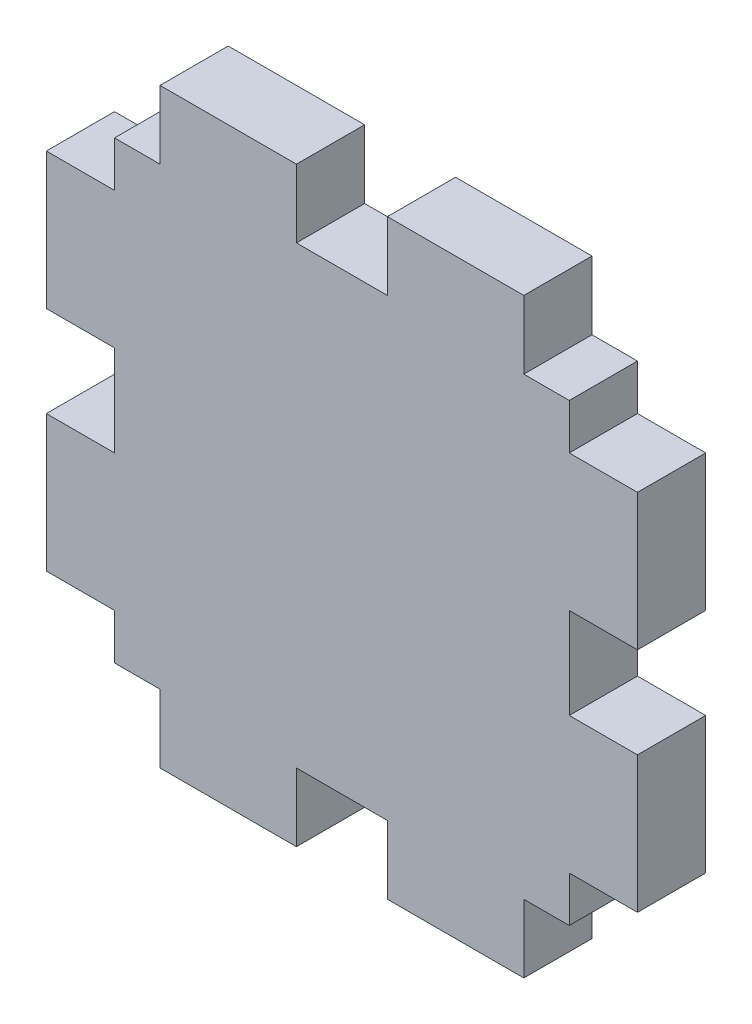
ISO-10303-21;
HEADER;
FILE_DESCRIPTION(('STEP AP214'),'2;1');
FILE_NAME('part.step','',(''),(''),'','','');
FILE_SCHEMA(('AUTOMOTIVE_DESIGN { 1 0 10303 214 1 1 1 1 }'));
ENDSEC;
DATA;
#1=APPLICATION_CONTEXT('core data for automotive mechanical design processes');
#2=APPLICATION_PROTOCOL_DEFINITION('international standard','automotive_design',2000,#1);
#3=PRODUCT_CONTEXT('',#1,'mechanical');
#4=PRODUCT('Part','Part','',(#3));
#5=PRODUCT_RELATED_PRODUCT_CATEGORY('part','',(#4));
#6=PRODUCT_DEFINITION_FORMATION('','',#4);
#7=PRODUCT_DEFINITION_CONTEXT('part definition',#1,'design');
#8=PRODUCT_DEFINITION('design','',#6,#7);
#9=PRODUCT_DEFINITION_SHAPE('','',#8);
#10=(LENGTH_UNIT() NAMED_UNIT(*) SI_UNIT(.MILLI.,.METRE.));
#11=(NAMED_UNIT(*) PLANE_ANGLE_UNIT() SI_UNIT($,.RADIAN.));
#12=(NAMED_UNIT(*) SI_UNIT($,.STERADIAN.) SOLID_ANGLE_UNIT());
#13=UNCERTAINTY_MEASURE_WITH_UNIT(LENGTH_MEASURE(1.E-05),#10,'distance_accuracy_value','');
#14=(GEOMETRIC_REPRESENTATION_CONTEXT(3) GLOBAL_UNCERTAINTY_ASSIGNED_CONTEXT((#13)) GLOBAL_UNIT_ASSIGNED_CONTEXT((#10,
#11,#12)) REPRESENTATION_CONTEXT('',''));
#15=CARTESIAN_POINT('',(0.,0.,0.));
#16=DIRECTION('',(0.,0.,1.));
#17=DIRECTION('',(1.,0.,0.));
#18=AXIS2_PLACEMENT_3D('',#15,#16,#17);
#19=CARTESIAN_POINT('',(8.,-10.,3.));
#20=DIRECTION('',(0.,1.,0.));
#21=DIRECTION('',(0.,0.,1.));
#22=AXIS2_PLACEMENT_3D('',#19,#20,#21);
#23=PLANE('',#22);
#24=DIRECTION('',(1.,0.,0.));
#25=VECTOR('',#24,1.);
#26=CARTESIAN_POINT('',(8.,-10.,0.));
#27=LINE('',#26,#25);
#28=CARTESIAN_POINT('',(8.,-10.,0.));
#29=VERTEX_POINT('',#28);
#30=CARTESIAN_POINT('',(10.,-10.,0.));
#31=VERTEX_POINT('',#30);
#32=EDGE_CURVE('E308',#29,#31,#27,.T.);
#33=ORIENTED_EDGE('',*,*,#32,.T.);
#34=DIRECTION('',(0.,0.,-1.));
#35=VECTOR('',#34,1.);
#36=CARTESIAN_POINT('',(10.,-10.,3.));
#37=LINE('',#36,#35);
#38=CARTESIAN_POINT('',(10.,-10.,3.));
#39=VERTEX_POINT('',#38);
#40=EDGE_CURVE('E11',#39,#31,#37,.T.);
#41=ORIENTED_EDGE('',*,*,#40,.F.);
#42=DIRECTION('',(1.,0.,0.));
#43=VECTOR('',#42,1.);
#44=CARTESIAN_POINT('',(8.,-10.,3.));
#45=LINE('',#44,#43);
#46=CARTESIAN_POINT('',(8.,-10.,3.));
#47=VERTEX_POINT('',#46);
#48=EDGE_CURVE('E414',#47,#39,#45,.T.);
#49=ORIENTED_EDGE('',*,*,#48,.F.);
#50=DIRECTION('',(0.,0.,-1.));
#51=VECTOR('',#50,1.);
#52=CARTESIAN_POINT('',(8.,-10.,3.));
#53=LINE('',#52,#51);
#54=EDGE_CURVE('E304',#47,#29,#53,.T.);
#55=ORIENTED_EDGE('',*,*,#54,.T.);
#56=EDGE_LOOP('',(#33,#41,#49,#55));
#57=FACE_BOUND('',#56,.T.);
#58=ADVANCED_FACE('F39',(#57),#23,.F.);
#59=CARTESIAN_POINT('',(10.,-8.,3.));
#60=DIRECTION('',(-1.,0.,0.));
#61=DIRECTION('',(0.,0.,1.));
#62=AXIS2_PLACEMENT_3D('',#59,#60,#61);
#63=PLANE('',#62);
#64=DIRECTION('',(0.,1.,0.));
#65=VECTOR('',#64,1.);
#66=CARTESIAN_POINT('',(10.,-8.,0.));
#67=LINE('',#66,#65);
#68=CARTESIAN_POINT('',(10.,-8.,0.));
#69=VERTEX_POINT('',#68);
#70=EDGE_CURVE('E312',#31,#69,#67,.T.);
#71=ORIENTED_EDGE('',*,*,#70,.T.);
#72=DIRECTION('',(0.,0.,-1.));
#73=VECTOR('',#72,1.);
#74=CARTESIAN_POINT('',(10.,-8.,3.));
#75=LINE('',#74,#73);
#76=CARTESIAN_POINT('',(10.,-8.,3.));
#77=VERTEX_POINT('',#76);
#78=EDGE_CURVE('E48',#77,#69,#75,.T.);
#79=ORIENTED_EDGE('',*,*,#78,.F.);
#80=DIRECTION('',(0.,1.,0.));
#81=VECTOR('',#80,1.);
#82=CARTESIAN_POINT('',(10.,-8.,3.));
#83=LINE('',#82,#81);
#84=EDGE_CURVE('E183',#39,#77,#83,.T.);
#85=ORIENTED_EDGE('',*,*,#84,.F.);
#86=ORIENTED_EDGE('',*,*,#40,.T.);
#87=EDGE_LOOP('',(#71,#79,#85,#86));
#88=FACE_BOUND('',#87,.T.);
#89=ADVANCED_FACE('F676',(#88),#63,.F.);
#90=CARTESIAN_POINT('',(10.,-8.,3.));
#91=DIRECTION('',(0.,1.,0.));
#92=DIRECTION('',(0.,0.,1.));
#93=AXIS2_PLACEMENT_3D('',#90,#91,#92);
#94=PLANE('',#93);
#95=DIRECTION('',(1.,0.,0.));
#96=VECTOR('',#95,1.);
#97=CARTESIAN_POINT('',(10.,-8.,0.));
#98=LINE('',#97,#96);
#99=CARTESIAN_POINT('',(13.,-8.,0.));
#100=VERTEX_POINT('',#99);
#101=EDGE_CURVE('E315',#69,#100,#98,.T.);
#102=ORIENTED_EDGE('',*,*,#101,.T.);
#103=DIRECTION('',(0.,0.,-1.));
#104=VECTOR('',#103,1.);
#105=CARTESIAN_POINT('',(13.,-8.,3.));
#106=LINE('',#105,#104);
#107=CARTESIAN_POINT('',(13.,-8.,3.));
#108=VERTEX_POINT('',#107);
#109=EDGE_CURVE('E537',#108,#100,#106,.T.);
#110=ORIENTED_EDGE('',*,*,#109,.F.);
#111=DIRECTION('',(1.,0.,0.));
#112=VECTOR('',#111,1.);
#113=CARTESIAN_POINT('',(10.,-8.,3.));
#114=LINE('',#113,#112);
#115=EDGE_CURVE('E547',#77,#108,#114,.T.);
#116=ORIENTED_EDGE('',*,*,#115,.F.);
#117=ORIENTED_EDGE('',*,*,#78,.T.);
#118=EDGE_LOOP('',(#102,#110,#116,#117));
#119=FACE_BOUND('',#118,.T.);
#120=ADVANCED_FACE('F545',(#119),#94,.F.);
#121=CARTESIAN_POINT('',(13.,-8.,3.));
#122=DIRECTION('',(-1.,0.,0.));
#123=DIRECTION('',(0.,-1.,0.));
#124=AXIS2_PLACEMENT_3D('',#121,#122,#123);
#125=PLANE('',#124);
#126=DIRECTION('',(0.,1.,0.));
#127=VECTOR('',#126,1.);
#128=CARTESIAN_POINT('',(13.,-8.,0.));
#129=LINE('',#128,#127);
#130=CARTESIAN_POINT('',(13.,-2.,0.));
#131=VERTEX_POINT('',#130);
#132=EDGE_CURVE('E318',#100,#131,#129,.T.);
#133=ORIENTED_EDGE('',*,*,#132,.T.);
#134=DIRECTION('',(0.,0.,-1.));
#135=VECTOR('',#134,1.);
#136=CARTESIAN_POINT('',(13.,-2.,3.));
#137=LINE('',#136,#135);
#138=CARTESIAN_POINT('',(13.,-2.,3.));
#139=VERTEX_POINT('',#138);
#140=EDGE_CURVE('E533',#139,#131,#137,.T.);
#141=ORIENTED_EDGE('',*,*,#140,.F.);
#142=DIRECTION('',(0.,1.,0.));
#143=VECTOR('',#142,1.);
#144=CARTESIAN_POINT('',(13.,-8.,3.));
#145=LINE('',#144,#143);
#146=EDGE_CURVE('E566',#108,#139,#145,.T.);
#147=ORIENTED_EDGE('',*,*,#146,.F.);
#148=ORIENTED_EDGE('',*,*,#109,.T.);
#149=EDGE_LOOP('',(#133,#141,#147,#148));
#150=FACE_BOUND('',#149,.T.);
#151=ADVANCED_FACE('F556',(#150),#125,.F.);
#152=CARTESIAN_POINT('',(10.,-2.,3.));
#153=DIRECTION('',(0.,-1.,0.));
#154=DIRECTION('',(0.,0.,-1.));
#155=AXIS2_PLACEMENT_3D('',#152,#153,#154);
#156=PLANE('',#155);
#157=DIRECTION('',(-1.,0.,0.));
#158=VECTOR('',#157,1.);
#159=CARTESIAN_POINT('',(10.,-2.,0.));
#160=LINE('',#159,#158);
#161=CARTESIAN_POINT('',(10.,-2.,0.));
#162=VERTEX_POINT('',#161);
#163=EDGE_CURVE('E321',#131,#162,#160,.T.);
#164=ORIENTED_EDGE('',*,*,#163,.T.);
#165=DIRECTION('',(0.,0.,-1.));
#166=VECTOR('',#165,1.);
#167=CARTESIAN_POINT('',(10.,-2.,3.));
#168=LINE('',#167,#166);
#169=CARTESIAN_POINT('',(10.,-2.,3.));
#170=VERTEX_POINT('',#169);
#171=EDGE_CURVE('E529',#170,#162,#168,.T.);
#172=ORIENTED_EDGE('',*,*,#171,.F.);
#173=DIRECTION('',(-1.,0.,0.));
#174=VECTOR('',#173,1.);
#175=CARTESIAN_POINT('',(10.,-2.,3.));
#176=LINE('',#175,#174);
#177=EDGE_CURVE('E562',#139,#170,#176,.T.);
#178=ORIENTED_EDGE('',*,*,#177,.F.);
#179=ORIENTED_EDGE('',*,*,#140,.T.);
#180=EDGE_LOOP('',(#164,#172,#178,#179));
#181=FACE_BOUND('',#180,.T.);
#182=ADVANCED_FACE('F560',(#181),#156,.F.);
#183=CARTESIAN_POINT('',(10.,2.,3.));
#184=DIRECTION('',(-1.,0.,0.));
#185=DIRECTION('',(0.,0.,1.));
#186=AXIS2_PLACEMENT_3D('',#183,#184,#185);
#187=PLANE('',#186);
#188=DIRECTION('',(0.,1.,0.));
#189=VECTOR('',#188,1.);
#190=CARTESIAN_POINT('',(10.,2.,0.));
#191=LINE('',#190,#189);
#192=CARTESIAN_POINT('',(10.,2.,0.));
#193=VERTEX_POINT('',#192);
#194=EDGE_CURVE('E324',#162,#193,#191,.T.);
#195=ORIENTED_EDGE('',*,*,#194,.T.);
#196=DIRECTION('',(0.,0.,-1.));
#197=VECTOR('',#196,1.);
#198=CARTESIAN_POINT('',(10.,2.,3.));
#199=LINE('',#198,#197);
#200=CARTESIAN_POINT('',(10.,2.,3.));
#201=VERTEX_POINT('',#200);
#202=EDGE_CURVE('E525',#201,#193,#199,.T.);
#203=ORIENTED_EDGE('',*,*,#202,.F.);
#204=DIRECTION('',(0.,1.,0.));
#205=VECTOR('',#204,1.);
#206=CARTESIAN_POINT('',(10.,2.,3.));
#207=LINE('',#206,#205);
#208=EDGE_CURVE('E565',#170,#201,#207,.T.);
#209=ORIENTED_EDGE('',*,*,#208,.F.);
#210=ORIENTED_EDGE('',*,*,#171,.T.);
#211=EDGE_LOOP('',(#195,#203,#209,#210));
#212=FACE_BOUND('',#211,.T.);
#213=ADVANCED_FACE('F689',(#212),#187,.F.);
#214=CARTESIAN_POINT('',(10.,2.,3.));
#215=DIRECTION('',(0.,1.,0.));
#216=DIRECTION('',(0.,0.,1.));
#217=AXIS2_PLACEMENT_3D('',#214,#215,#216);
#218=PLANE('',#217);
#219=DIRECTION('',(1.,0.,0.));
#220=VECTOR('',#219,1.);
#221=CARTESIAN_POINT('',(10.,2.,0.));
#222=LINE('',#221,#220);
#223=CARTESIAN_POINT('',(13.,2.,0.));
#224=VERTEX_POINT('',#223);
#225=EDGE_CURVE('E327',#193,#224,#222,.T.);
#226=ORIENTED_EDGE('',*,*,#225,.T.);
#227=DIRECTION('',(0.,0.,-1.));
#228=VECTOR('',#227,1.);
#229=CARTESIAN_POINT('',(13.,2.,3.));
#230=LINE('',#229,#228);
#231=CARTESIAN_POINT('',(13.,2.,3.));
#232=VERTEX_POINT('',#231);
#233=EDGE_CURVE('E521',#232,#224,#230,.T.);
#234=ORIENTED_EDGE('',*,*,#233,.F.);
#235=DIRECTION('',(1.,0.,0.));
#236=VECTOR('',#235,1.);
#237=CARTESIAN_POINT('',(10.,2.,3.));
#238=LINE('',#237,#236);
#239=EDGE_CURVE('E570',#201,#232,#238,.T.);
#240=ORIENTED_EDGE('',*,*,#239,.F.);
#241=ORIENTED_EDGE('',*,*,#202,.T.);
#242=EDGE_LOOP('',(#226,#234,#240,#241));
#243=FACE_BOUND('',#242,.T.);
#244=ADVANCED_FACE('F692',(#243),#218,.F.);
#245=CARTESIAN_POINT('',(13.,8.,3.));
#246=DIRECTION('',(-1.,0.,0.));
#247=DIRECTION('',(0.,-1.,0.));
#248=AXIS2_PLACEMENT_3D('',#245,#246,#247);
#249=PLANE('',#248);
#250=DIRECTION('',(0.,1.,0.));
#251=VECTOR('',#250,1.);
#252=CARTESIAN_POINT('',(13.,8.,0.));
#253=LINE('',#252,#251);
#254=CARTESIAN_POINT('',(13.,8.,0.));
#255=VERTEX_POINT('',#254);
#256=EDGE_CURVE('E330',#224,#255,#253,.T.);
#257=ORIENTED_EDGE('',*,*,#256,.T.);
#258=DIRECTION('',(0.,0.,-1.));
#259=VECTOR('',#258,1.);
#260=CARTESIAN_POINT('',(13.,8.,3.));
#261=LINE('',#260,#259);
#262=CARTESIAN_POINT('',(13.,8.,3.));
#263=VERTEX_POINT('',#262);
#264=EDGE_CURVE('E517',#263,#255,#261,.T.);
#265=ORIENTED_EDGE('',*,*,#264,.F.);
#266=DIRECTION('',(0.,1.,0.));
#267=VECTOR('',#266,1.);
#268=CARTESIAN_POINT('',(13.,8.,3.));
#269=LINE('',#268,#267);
#270=EDGE_CURVE('E577',#232,#263,#269,.T.);
#271=ORIENTED_EDGE('',*,*,#270,.F.);
#272=ORIENTED_EDGE('',*,*,#233,.T.);
#273=EDGE_LOOP('',(#257,#265,#271,#272));
#274=FACE_BOUND('',#273,.T.);
#275=ADVANCED_FACE('F696',(#274),#249,.F.);
#276=CARTESIAN_POINT('',(10.,8.,3.));
#277=DIRECTION('',(0.,-1.,0.));
#278=DIRECTION('',(0.,0.,-1.));
#279=AXIS2_PLACEMENT_3D('',#276,#277,#278);
#280=PLANE('',#279);
#281=DIRECTION('',(-1.,0.,0.));
#282=VECTOR('',#281,1.);
#283=CARTESIAN_POINT('',(10.,8.,0.));
#284=LINE('',#283,#282);
#285=CARTESIAN_POINT('',(10.,8.,0.));
#286=VERTEX_POINT('',#285);
#287=EDGE_CURVE('E333',#255,#286,#284,.T.);
#288=ORIENTED_EDGE('',*,*,#287,.T.);
#289=DIRECTION('',(0.,0.,-1.));
#290=VECTOR('',#289,1.);
#291=CARTESIAN_POINT('',(10.,8.,3.));
#292=LINE('',#291,#290);
#293=CARTESIAN_POINT('',(10.,8.,3.));
#294=VERTEX_POINT('',#293);
#295=EDGE_CURVE('E513',#294,#286,#292,.T.);
#296=ORIENTED_EDGE('',*,*,#295,.F.);
#297=DIRECTION('',(-1.,0.,0.));
#298=VECTOR('',#297,1.);
#299=CARTESIAN_POINT('',(10.,8.,3.));
#300=LINE('',#299,#298);
#301=EDGE_CURVE('E580',#263,#294,#300,.T.);
#302=ORIENTED_EDGE('',*,*,#301,.F.);
#303=ORIENTED_EDGE('',*,*,#264,.T.);
#304=EDGE_LOOP('',(#288,#296,#302,#303));
#305=FACE_BOUND('',#304,.T.);
#306=ADVANCED_FACE('F700',(#305),#280,.F.);
#307=CARTESIAN_POINT('',(10.,10.,3.));
#308=DIRECTION('',(-1.,0.,0.));
#309=DIRECTION('',(0.,0.,1.));
#310=AXIS2_PLACEMENT_3D('',#307,#308,#309);
#311=PLANE('',#310);
#312=DIRECTION('',(0.,1.,0.));
#313=VECTOR('',#312,1.);
#314=CARTESIAN_POINT('',(10.,10.,0.));
#315=LINE('',#314,#313);
#316=CARTESIAN_POINT('',(10.,10.,0.));
#317=VERTEX_POINT('',#316);
#318=EDGE_CURVE('E336',#286,#317,#315,.T.);
#319=ORIENTED_EDGE('',*,*,#318,.T.);
#320=DIRECTION('',(0.,0.,-1.));
#321=VECTOR('',#320,1.);
#322=CARTESIAN_POINT('',(10.,10.,3.));
#323=LINE('',#322,#321);
#324=CARTESIAN_POINT('',(10.,10.,3.));
#325=VERTEX_POINT('',#324);
#326=EDGE_CURVE('E509',#325,#317,#323,.T.);
#327=ORIENTED_EDGE('',*,*,#326,.F.);
#328=DIRECTION('',(0.,1.,0.));
#329=VECTOR('',#328,1.);
#330=CARTESIAN_POINT('',(10.,10.,3.));
#331=LINE('',#330,#329);
#332=EDGE_CURVE('E583',#294,#325,#331,.T.);
#333=ORIENTED_EDGE('',*,*,#332,.F.);
#334=ORIENTED_EDGE('',*,*,#295,.T.);
#335=EDGE_LOOP('',(#319,#327,#333,#334));
#336=FACE_BOUND('',#335,.T.);
#337=ADVANCED_FACE('F704',(#336),#311,.F.);
#338=CARTESIAN_POINT('',(8.,10.,3.));
#339=DIRECTION('',(0.,-1.,0.));
#340=DIRECTION('',(0.,0.,-1.));
#341=AXIS2_PLACEMENT_3D('',#338,#339,#340);
#342=PLANE('',#341);
#343=DIRECTION('',(-1.,0.,0.));
#344=VECTOR('',#343,1.);
#345=CARTESIAN_POINT('',(8.,10.,0.));
#346=LINE('',#345,#344);
#347=CARTESIAN_POINT('',(8.,10.,0.));
#348=VERTEX_POINT('',#347);
#349=EDGE_CURVE('E339',#317,#348,#346,.T.);
#350=ORIENTED_EDGE('',*,*,#349,.T.);
#351=DIRECTION('',(0.,0.,-1.));
#352=VECTOR('',#351,1.);
#353=CARTESIAN_POINT('',(8.,10.,3.));
#354=LINE('',#353,#352);
#355=CARTESIAN_POINT('',(8.,10.,3.));
#356=VERTEX_POINT('',#355);
#357=EDGE_CURVE('E505',#356,#348,#354,.T.);
#358=ORIENTED_EDGE('',*,*,#357,.F.);
#359=DIRECTION('',(-1.,0.,0.));
#360=VECTOR('',#359,1.);
#361=CARTESIAN_POINT('',(8.,10.,3.));
#362=LINE('',#361,#360);
#363=EDGE_CURVE('E586',#325,#356,#362,.T.);
#364=ORIENTED_EDGE('',*,*,#363,.F.);
#365=ORIENTED_EDGE('',*,*,#326,.T.);
#366=EDGE_LOOP('',(#350,#358,#364,#365));
#367=FACE_BOUND('',#366,.T.);
#368=ADVANCED_FACE('F708',(#367),#342,.F.);
#369=CARTESIAN_POINT('',(8.,10.,3.));
#370=DIRECTION('',(-1.,0.,0.));
#371=DIRECTION('',(0.,0.,1.));
#372=AXIS2_PLACEMENT_3D('',#369,#370,#371);
#373=PLANE('',#372);
#374=DIRECTION('',(0.,1.,0.));
#375=VECTOR('',#374,1.);
#376=CARTESIAN_POINT('',(8.,10.,0.));
#377=LINE('',#376,#375);
#378=CARTESIAN_POINT('',(8.,13.,0.));
#379=VERTEX_POINT('',#378);
#380=EDGE_CURVE('E342',#348,#379,#377,.T.);
#381=ORIENTED_EDGE('',*,*,#380,.T.);
#382=DIRECTION('',(0.,0.,-1.));
#383=VECTOR('',#382,1.);
#384=CARTESIAN_POINT('',(8.,13.,3.));
#385=LINE('',#384,#383);
#386=CARTESIAN_POINT('',(8.,13.,3.));
#387=VERTEX_POINT('',#386);
#388=EDGE_CURVE('E501',#387,#379,#385,.T.);
#389=ORIENTED_EDGE('',*,*,#388,.F.);
#390=DIRECTION('',(0.,1.,0.));
#391=VECTOR('',#390,1.);
#392=CARTESIAN_POINT('',(8.,10.,3.));
#393=LINE('',#392,#391);
#394=EDGE_CURVE('E589',#356,#387,#393,.T.);
#395=ORIENTED_EDGE('',*,*,#394,.F.);
#396=ORIENTED_EDGE('',*,*,#357,.T.);
#397=EDGE_LOOP('',(#381,#389,#395,#396));
#398=FACE_BOUND('',#397,.T.);
#399=ADVANCED_FACE('F712',(#398),#373,.F.);
#400=CARTESIAN_POINT('',(2.,13.,3.));
#401=DIRECTION('',(0.,-1.,0.));
#402=DIRECTION('',(1.,0.,0.));
#403=AXIS2_PLACEMENT_3D('',#400,#401,#402);
#404=PLANE('',#403);
#405=DIRECTION('',(-1.,0.,0.));
#406=VECTOR('',#405,1.);
#407=CARTESIAN_POINT('',(2.,13.,0.));
#408=LINE('',#407,#406);
#409=CARTESIAN_POINT('',(2.,13.,0.));
#410=VERTEX_POINT('',#409);
#411=EDGE_CURVE('E345',#379,#410,#408,.T.);
#412=ORIENTED_EDGE('',*,*,#411,.T.);
#413=DIRECTION('',(0.,0.,-1.));
#414=VECTOR('',#413,1.);
#415=CARTESIAN_POINT('',(2.,13.,3.));
#416=LINE('',#415,#414);
#417=CARTESIAN_POINT('',(2.,13.,3.));
#418=VERTEX_POINT('',#417);
#419=EDGE_CURVE('E497',#418,#410,#416,.T.);
#420=ORIENTED_EDGE('',*,*,#419,.F.);
#421=DIRECTION('',(-1.,0.,0.));
#422=VECTOR('',#421,1.);
#423=CARTESIAN_POINT('',(2.,13.,3.));
#424=LINE('',#423,#422);
#425=EDGE_CURVE('E592',#387,#418,#424,.T.);
#426=ORIENTED_EDGE('',*,*,#425,.F.);
#427=ORIENTED_EDGE('',*,*,#388,.T.);
#428=EDGE_LOOP('',(#412,#420,#426,#427));
#429=FACE_BOUND('',#428,.T.);
#430=ADVANCED_FACE('F716',(#429),#404,.F.);
#431=CARTESIAN_POINT('',(2.,10.,3.));
#432=DIRECTION('',(1.,0.,0.));
#433=DIRECTION('',(0.,0.,-1.));
#434=AXIS2_PLACEMENT_3D('',#431,#432,#433);
#435=PLANE('',#434);
#436=DIRECTION('',(0.,-1.,0.));
#437=VECTOR('',#436,1.);
#438=CARTESIAN_POINT('',(2.,10.,0.));
#439=LINE('',#438,#437);
#440=CARTESIAN_POINT('',(2.,10.,0.));
#441=VERTEX_POINT('',#440);
#442=EDGE_CURVE('E348',#410,#441,#439,.T.);
#443=ORIENTED_EDGE('',*,*,#442,.T.);
#444=DIRECTION('',(0.,0.,-1.));
#445=VECTOR('',#444,1.);
#446=CARTESIAN_POINT('',(2.,10.,3.));
#447=LINE('',#446,#445);
#448=CARTESIAN_POINT('',(2.,10.,3.));
#449=VERTEX_POINT('',#448);
#450=EDGE_CURVE('E493',#449,#441,#447,.T.);
#451=ORIENTED_EDGE('',*,*,#450,.F.);
#452=DIRECTION('',(0.,-1.,0.));
#453=VECTOR('',#452,1.);
#454=CARTESIAN_POINT('',(2.,10.,3.));
#455=LINE('',#454,#453);
#456=EDGE_CURVE('E595',#418,#449,#455,.T.);
#457=ORIENTED_EDGE('',*,*,#456,.F.);
#458=ORIENTED_EDGE('',*,*,#419,.T.);
#459=EDGE_LOOP('',(#443,#451,#457,#458));
#460=FACE_BOUND('',#459,.T.);
#461=ADVANCED_FACE('F720',(#460),#435,.F.);
#462=CARTESIAN_POINT('',(-2.,10.,3.));
#463=DIRECTION('',(0.,-1.,0.));
#464=DIRECTION('',(0.,0.,-1.));
#465=AXIS2_PLACEMENT_3D('',#462,#463,#464);
#466=PLANE('',#465);
#467=DIRECTION('',(-1.,0.,0.));
#468=VECTOR('',#467,1.);
#469=CARTESIAN_POINT('',(-2.,10.,0.));
#470=LINE('',#469,#468);
#471=CARTESIAN_POINT('',(-2.,10.,0.));
#472=VERTEX_POINT('',#471);
#473=EDGE_CURVE('E351',#441,#472,#470,.T.);
#474=ORIENTED_EDGE('',*,*,#473,.T.);
#475=DIRECTION('',(0.,0.,-1.));
#476=VECTOR('',#475,1.);
#477=CARTESIAN_POINT('',(-2.,10.,3.));
#478=LINE('',#477,#476);
#479=CARTESIAN_POINT('',(-2.,10.,3.));
#480=VERTEX_POINT('',#479);
#481=EDGE_CURVE('E489',#480,#472,#478,.T.);
#482=ORIENTED_EDGE('',*,*,#481,.F.);
#483=DIRECTION('',(-1.,0.,0.));
#484=VECTOR('',#483,1.);
#485=CARTESIAN_POINT('',(-2.,10.,3.));
#486=LINE('',#485,#484);
#487=EDGE_CURVE('E598',#449,#480,#486,.T.);
#488=ORIENTED_EDGE('',*,*,#487,.F.);
#489=ORIENTED_EDGE('',*,*,#450,.T.);
#490=EDGE_LOOP('',(#474,#482,#488,#489));
#491=FACE_BOUND('',#490,.T.);
#492=ADVANCED_FACE('F724',(#491),#466,.F.);
#493=CARTESIAN_POINT('',(-2.,10.,3.));
#494=DIRECTION('',(-1.,0.,0.));
#495=DIRECTION('',(0.,0.,1.));
#496=AXIS2_PLACEMENT_3D('',#493,#494,#495);
#497=PLANE('',#496);
#498=DIRECTION('',(0.,1.,0.));
#499=VECTOR('',#498,1.);
#500=CARTESIAN_POINT('',(-2.,10.,0.));
#501=LINE('',#500,#499);
#502=CARTESIAN_POINT('',(-2.,13.,0.));
#503=VERTEX_POINT('',#502);
#504=EDGE_CURVE('E354',#472,#503,#501,.T.);
#505=ORIENTED_EDGE('',*,*,#504,.T.);
#506=DIRECTION('',(0.,0.,-1.));
#507=VECTOR('',#506,1.);
#508=CARTESIAN_POINT('',(-2.,13.,3.));
#509=LINE('',#508,#507);
#510=CARTESIAN_POINT('',(-2.,13.,3.));
#511=VERTEX_POINT('',#510);
#512=EDGE_CURVE('E485',#511,#503,#509,.T.);
#513=ORIENTED_EDGE('',*,*,#512,.F.);
#514=DIRECTION('',(0.,1.,0.));
#515=VECTOR('',#514,1.);
#516=CARTESIAN_POINT('',(-2.,10.,3.));
#517=LINE('',#516,#515);
#518=EDGE_CURVE('E601',#480,#511,#517,.T.);
#519=ORIENTED_EDGE('',*,*,#518,.F.);
#520=ORIENTED_EDGE('',*,*,#481,.T.);
#521=EDGE_LOOP('',(#505,#513,#519,#520));
#522=FACE_BOUND('',#521,.T.);
#523=ADVANCED_FACE('F728',(#522),#497,.F.);
#524=CARTESIAN_POINT('',(-2.,13.,3.));
#525=DIRECTION('',(0.,-1.,0.));
#526=DIRECTION('',(1.,0.,0.));
#527=AXIS2_PLACEMENT_3D('',#524,#525,#526);
#528=PLANE('',#527);
#529=DIRECTION('',(-1.,0.,0.));
#530=VECTOR('',#529,1.);
#531=CARTESIAN_POINT('',(-2.,13.,0.));
#532=LINE('',#531,#530);
#533=CARTESIAN_POINT('',(-8.,13.,0.));
#534=VERTEX_POINT('',#533);
#535=EDGE_CURVE('E357',#503,#534,#532,.T.);
#536=ORIENTED_EDGE('',*,*,#535,.T.);
#537=DIRECTION('',(0.,0.,-1.));
#538=VECTOR('',#537,1.);
#539=CARTESIAN_POINT('',(-8.,13.,3.));
#540=LINE('',#539,#538);
#541=CARTESIAN_POINT('',(-8.,13.,3.));
#542=VERTEX_POINT('',#541);
#543=EDGE_CURVE('E481',#542,#534,#540,.T.);
#544=ORIENTED_EDGE('',*,*,#543,.F.);
#545=DIRECTION('',(-1.,0.,0.));
#546=VECTOR('',#545,1.);
#547=CARTESIAN_POINT('',(-2.,13.,3.));
#548=LINE('',#547,#546);
#549=EDGE_CURVE('E604',#511,#542,#548,.T.);
#550=ORIENTED_EDGE('',*,*,#549,.F.);
#551=ORIENTED_EDGE('',*,*,#512,.T.);
#552=EDGE_LOOP('',(#536,#544,#550,#551));
#553=FACE_BOUND('',#552,.T.);
#554=ADVANCED_FACE('F732',(#553),#528,.F.);
#555=CARTESIAN_POINT('',(-8.,10.,3.));
#556=DIRECTION('',(1.,0.,0.));
#557=DIRECTION('',(0.,0.,-1.));
#558=AXIS2_PLACEMENT_3D('',#555,#556,#557);
#559=PLANE('',#558);
#560=DIRECTION('',(0.,-1.,0.));
#561=VECTOR('',#560,1.);
#562=CARTESIAN_POINT('',(-8.,10.,0.));
#563=LINE('',#562,#561);
#564=CARTESIAN_POINT('',(-8.,10.,0.));
#565=VERTEX_POINT('',#564);
#566=EDGE_CURVE('E360',#534,#565,#563,.T.);
#567=ORIENTED_EDGE('',*,*,#566,.T.);
#568=DIRECTION('',(0.,0.,-1.));
#569=VECTOR('',#568,1.);
#570=CARTESIAN_POINT('',(-8.,10.,3.));
#571=LINE('',#570,#569);
#572=CARTESIAN_POINT('',(-8.,10.,3.));
#573=VERTEX_POINT('',#572);
#574=EDGE_CURVE('E477',#573,#565,#571,.T.);
#575=ORIENTED_EDGE('',*,*,#574,.F.);
#576=DIRECTION('',(0.,-1.,0.));
#577=VECTOR('',#576,1.);
#578=CARTESIAN_POINT('',(-8.,10.,3.));
#579=LINE('',#578,#577);
#580=EDGE_CURVE('E607',#542,#573,#579,.T.);
#581=ORIENTED_EDGE('',*,*,#580,.F.);
#582=ORIENTED_EDGE('',*,*,#543,.T.);
#583=EDGE_LOOP('',(#567,#575,#581,#582));
#584=FACE_BOUND('',#583,.T.);
#585=ADVANCED_FACE('F736',(#584),#559,.F.);
#586=CARTESIAN_POINT('',(-10.,10.,3.));
#587=DIRECTION('',(0.,-1.,0.));
#588=DIRECTION('',(0.,0.,-1.));
#589=AXIS2_PLACEMENT_3D('',#586,#587,#588);
#590=PLANE('',#589);
#591=DIRECTION('',(-1.,0.,0.));
#592=VECTOR('',#591,1.);
#593=CARTESIAN_POINT('',(-10.,10.,0.));
#594=LINE('',#593,#592);
#595=CARTESIAN_POINT('',(-10.,10.,0.));
#596=VERTEX_POINT('',#595);
#597=EDGE_CURVE('E363',#565,#596,#594,.T.);
#598=ORIENTED_EDGE('',*,*,#597,.T.);
#599=DIRECTION('',(0.,0.,-1.));
#600=VECTOR('',#599,1.);
#601=CARTESIAN_POINT('',(-10.,10.,3.));
#602=LINE('',#601,#600);
#603=CARTESIAN_POINT('',(-10.,10.,3.));
#604=VERTEX_POINT('',#603);
#605=EDGE_CURVE('E473',#604,#596,#602,.T.);
#606=ORIENTED_EDGE('',*,*,#605,.F.);
#607=DIRECTION('',(-1.,0.,0.));
#608=VECTOR('',#607,1.);
#609=CARTESIAN_POINT('',(-10.,10.,3.));
#610=LINE('',#609,#608);
#611=EDGE_CURVE('E610',#573,#604,#610,.T.);
#612=ORIENTED_EDGE('',*,*,#611,.F.);
#613=ORIENTED_EDGE('',*,*,#574,.T.);
#614=EDGE_LOOP('',(#598,#606,#612,#613));
#615=FACE_BOUND('',#614,.T.);
#616=ADVANCED_FACE('F740',(#615),#590,.F.);
#617=CARTESIAN_POINT('',(-10.,10.,3.));
#618=DIRECTION('',(1.,0.,0.));
#619=DIRECTION('',(0.,1.,0.));
#620=AXIS2_PLACEMENT_3D('',#617,#618,#619);
#621=PLANE('',#620);
#622=DIRECTION('',(0.,-1.,0.));
#623=VECTOR('',#622,1.);
#624=CARTESIAN_POINT('',(-10.,10.,0.));
#625=LINE('',#624,#623);
#626=CARTESIAN_POINT('',(-10.,8.,0.));
#627=VERTEX_POINT('',#626);
#628=EDGE_CURVE('E366',#596,#627,#625,.T.);
#629=ORIENTED_EDGE('',*,*,#628,.T.);
#630=DIRECTION('',(0.,0.,-1.));
#631=VECTOR('',#630,1.);
#632=CARTESIAN_POINT('',(-10.,8.,3.));
#633=LINE('',#632,#631);
#634=CARTESIAN_POINT('',(-10.,8.,3.));
#635=VERTEX_POINT('',#634);
#636=EDGE_CURVE('E469',#635,#627,#633,.T.);
#637=ORIENTED_EDGE('',*,*,#636,.F.);
#638=DIRECTION('',(0.,-1.,0.));
#639=VECTOR('',#638,1.);
#640=CARTESIAN_POINT('',(-10.,10.,3.));
#641=LINE('',#640,#639);
#642=EDGE_CURVE('E613',#604,#635,#641,.T.);
#643=ORIENTED_EDGE('',*,*,#642,.F.);
#644=ORIENTED_EDGE('',*,*,#605,.T.);
#645=EDGE_LOOP('',(#629,#637,#643,#644));
#646=FACE_BOUND('',#645,.T.);
#647=ADVANCED_FACE('F744',(#646),#621,.F.);
#648=CARTESIAN_POINT('',(-10.,8.,3.));
#649=DIRECTION('',(0.,-1.,0.));
#650=DIRECTION('',(0.,0.,-1.));
#651=AXIS2_PLACEMENT_3D('',#648,#649,#650);
#652=PLANE('',#651);
#653=DIRECTION('',(-1.,0.,0.));
#654=VECTOR('',#653,1.);
#655=CARTESIAN_POINT('',(-10.,8.,0.));
#656=LINE('',#655,#654);
#657=CARTESIAN_POINT('',(-13.,8.,0.));
#658=VERTEX_POINT('',#657);
#659=EDGE_CURVE('E369',#627,#658,#656,.T.);
#660=ORIENTED_EDGE('',*,*,#659,.T.);
#661=DIRECTION('',(0.,0.,-1.));
#662=VECTOR('',#661,1.);
#663=CARTESIAN_POINT('',(-13.,8.,3.));
#664=LINE('',#663,#662);
#665=CARTESIAN_POINT('',(-13.,8.,3.));
#666=VERTEX_POINT('',#665);
#667=EDGE_CURVE('E465',#666,#658,#664,.T.);
#668=ORIENTED_EDGE('',*,*,#667,.F.);
#669=DIRECTION('',(-1.,0.,0.));
#670=VECTOR('',#669,1.);
#671=CARTESIAN_POINT('',(-10.,8.,3.));
#672=LINE('',#671,#670);
#673=EDGE_CURVE('E616',#635,#666,#672,.T.);
#674=ORIENTED_EDGE('',*,*,#673,.F.);
#675=ORIENTED_EDGE('',*,*,#636,.T.);
#676=EDGE_LOOP('',(#660,#668,#674,#675));
#677=FACE_BOUND('',#676,.T.);
#678=ADVANCED_FACE('F748',(#677),#652,.F.);
#679=CARTESIAN_POINT('',(-13.,8.,3.));
#680=DIRECTION('',(1.,0.,0.));
#681=DIRECTION('',(0.,1.,0.));
#682=AXIS2_PLACEMENT_3D('',#679,#680,#681);
#683=PLANE('',#682);
#684=DIRECTION('',(0.,-1.,0.));
#685=VECTOR('',#684,1.);
#686=CARTESIAN_POINT('',(-13.,8.,0.));
#687=LINE('',#686,#685);
#688=CARTESIAN_POINT('',(-13.,2.,0.));
#689=VERTEX_POINT('',#688);
#690=EDGE_CURVE('E372',#658,#689,#687,.T.);
#691=ORIENTED_EDGE('',*,*,#690,.T.);
#692=DIRECTION('',(0.,0.,-1.));
#693=VECTOR('',#692,1.);
#694=CARTESIAN_POINT('',(-13.,2.,3.));
#695=LINE('',#694,#693);
#696=CARTESIAN_POINT('',(-13.,2.,3.));
#697=VERTEX_POINT('',#696);
#698=EDGE_CURVE('E461',#697,#689,#695,.T.);
#699=ORIENTED_EDGE('',*,*,#698,.F.);
#700=DIRECTION('',(0.,-1.,0.));
#701=VECTOR('',#700,1.);
#702=CARTESIAN_POINT('',(-13.,8.,3.));
#703=LINE('',#702,#701);
#704=EDGE_CURVE('E619',#666,#697,#703,.T.);
#705=ORIENTED_EDGE('',*,*,#704,.F.);
#706=ORIENTED_EDGE('',*,*,#667,.T.);
#707=EDGE_LOOP('',(#691,#699,#705,#706));
#708=FACE_BOUND('',#707,.T.);
#709=ADVANCED_FACE('F752',(#708),#683,.F.);
#710=CARTESIAN_POINT('',(-10.,2.,3.));
#711=DIRECTION('',(0.,1.,0.));
#712=DIRECTION('',(0.,0.,1.));
#713=AXIS2_PLACEMENT_3D('',#710,#711,#712);
#714=PLANE('',#713);
#715=DIRECTION('',(1.,0.,0.));
#716=VECTOR('',#715,1.);
#717=CARTESIAN_POINT('',(-10.,2.,0.));
#718=LINE('',#717,#716);
#719=CARTESIAN_POINT('',(-10.,2.,0.));
#720=VERTEX_POINT('',#719);
#721=EDGE_CURVE('E375',#689,#720,#718,.T.);
#722=ORIENTED_EDGE('',*,*,#721,.T.);
#723=DIRECTION('',(0.,0.,-1.));
#724=VECTOR('',#723,1.);
#725=CARTESIAN_POINT('',(-10.,2.,3.));
#726=LINE('',#725,#724);
#727=CARTESIAN_POINT('',(-10.,2.,3.));
#728=VERTEX_POINT('',#727);
#729=EDGE_CURVE('E457',#728,#720,#726,.T.);
#730=ORIENTED_EDGE('',*,*,#729,.F.);
#731=DIRECTION('',(1.,0.,0.));
#732=VECTOR('',#731,1.);
#733=CARTESIAN_POINT('',(-10.,2.,3.));
#734=LINE('',#733,#732);
#735=EDGE_CURVE('E622',#697,#728,#734,.T.);
#736=ORIENTED_EDGE('',*,*,#735,.F.);
#737=ORIENTED_EDGE('',*,*,#698,.T.);
#738=EDGE_LOOP('',(#722,#730,#736,#737));
#739=FACE_BOUND('',#738,.T.);
#740=ADVANCED_FACE('F756',(#739),#714,.F.);
#741=CARTESIAN_POINT('',(-10.,2.,3.));
#742=DIRECTION('',(1.,0.,0.));
#743=DIRECTION('',(0.,0.,-1.));
#744=AXIS2_PLACEMENT_3D('',#741,#742,#743);
#745=PLANE('',#744);
#746=DIRECTION('',(0.,-1.,0.));
#747=VECTOR('',#746,1.);
#748=CARTESIAN_POINT('',(-10.,2.,0.));
#749=LINE('',#748,#747);
#750=CARTESIAN_POINT('',(-10.,-2.,0.));
#751=VERTEX_POINT('',#750);
#752=EDGE_CURVE('E378',#720,#751,#749,.T.);
#753=ORIENTED_EDGE('',*,*,#752,.T.);
#754=DIRECTION('',(0.,0.,-1.));
#755=VECTOR('',#754,1.);
#756=CARTESIAN_POINT('',(-10.,-2.,3.));
#757=LINE('',#756,#755);
#758=CARTESIAN_POINT('',(-10.,-2.,3.));
#759=VERTEX_POINT('',#758);
#760=EDGE_CURVE('E453',#759,#751,#757,.T.);
#761=ORIENTED_EDGE('',*,*,#760,.F.);
#762=DIRECTION('',(0.,-1.,0.));
#763=VECTOR('',#762,1.);
#764=CARTESIAN_POINT('',(-10.,2.,3.));
#765=LINE('',#764,#763);
#766=EDGE_CURVE('E625',#728,#759,#765,.T.);
#767=ORIENTED_EDGE('',*,*,#766,.F.);
#768=ORIENTED_EDGE('',*,*,#729,.T.);
#769=EDGE_LOOP('',(#753,#761,#767,#768));
#770=FACE_BOUND('',#769,.T.);
#771=ADVANCED_FACE('F760',(#770),#745,.F.);
#772=CARTESIAN_POINT('',(-10.,-2.,3.));
#773=DIRECTION('',(0.,-1.,0.));
#774=DIRECTION('',(0.,0.,-1.));
#775=AXIS2_PLACEMENT_3D('',#772,#773,#774);
#776=PLANE('',#775);
#777=DIRECTION('',(-1.,0.,0.));
#778=VECTOR('',#777,1.);
#779=CARTESIAN_POINT('',(-10.,-2.,0.));
#780=LINE('',#779,#778);
#781=CARTESIAN_POINT('',(-13.,-2.,0.));
#782=VERTEX_POINT('',#781);
#783=EDGE_CURVE('E381',#751,#782,#780,.T.);
#784=ORIENTED_EDGE('',*,*,#783,.T.);
#785=DIRECTION('',(0.,0.,-1.));
#786=VECTOR('',#785,1.);
#787=CARTESIAN_POINT('',(-13.,-2.,3.));
#788=LINE('',#787,#786);
#789=CARTESIAN_POINT('',(-13.,-2.,3.));
#790=VERTEX_POINT('',#789);
#791=EDGE_CURVE('E449',#790,#782,#788,.T.);
#792=ORIENTED_EDGE('',*,*,#791,.F.);
#793=DIRECTION('',(-1.,0.,0.));
#794=VECTOR('',#793,1.);
#795=CARTESIAN_POINT('',(-10.,-2.,3.));
#796=LINE('',#795,#794);
#797=EDGE_CURVE('E628',#759,#790,#796,.T.);
#798=ORIENTED_EDGE('',*,*,#797,.F.);
#799=ORIENTED_EDGE('',*,*,#760,.T.);
#800=EDGE_LOOP('',(#784,#792,#798,#799));
#801=FACE_BOUND('',#800,.T.);
#802=ADVANCED_FACE('F764',(#801),#776,.F.);
#803=CARTESIAN_POINT('',(-13.,-8.,3.));
#804=DIRECTION('',(1.,0.,0.));
#805=DIRECTION('',(0.,1.,0.));
#806=AXIS2_PLACEMENT_3D('',#803,#804,#805);
#807=PLANE('',#806);
#808=DIRECTION('',(0.,-1.,0.));
#809=VECTOR('',#808,1.);
#810=CARTESIAN_POINT('',(-13.,-8.,0.));
#811=LINE('',#810,#809);
#812=CARTESIAN_POINT('',(-13.,-8.,0.));
#813=VERTEX_POINT('',#812);
#814=EDGE_CURVE('E384',#782,#813,#811,.T.);
#815=ORIENTED_EDGE('',*,*,#814,.T.);
#816=DIRECTION('',(0.,0.,-1.));
#817=VECTOR('',#816,1.);
#818=CARTESIAN_POINT('',(-13.,-8.,3.));
#819=LINE('',#818,#817);
#820=CARTESIAN_POINT('',(-13.,-8.,3.));
#821=VERTEX_POINT('',#820);
#822=EDGE_CURVE('E445',#821,#813,#819,.T.);
#823=ORIENTED_EDGE('',*,*,#822,.F.);
#824=DIRECTION('',(0.,-1.,0.));
#825=VECTOR('',#824,1.);
#826=CARTESIAN_POINT('',(-13.,-8.,3.));
#827=LINE('',#826,#825);
#828=EDGE_CURVE('E631',#790,#821,#827,.T.);
#829=ORIENTED_EDGE('',*,*,#828,.F.);
#830=ORIENTED_EDGE('',*,*,#791,.T.);
#831=EDGE_LOOP('',(#815,#823,#829,#830));
#832=FACE_BOUND('',#831,.T.);
#833=ADVANCED_FACE('F768',(#832),#807,.F.);
#834=CARTESIAN_POINT('',(-10.,-8.,3.));
#835=DIRECTION('',(0.,1.,0.));
#836=DIRECTION('',(0.,0.,1.));
#837=AXIS2_PLACEMENT_3D('',#834,#835,#836);
#838=PLANE('',#837);
#839=DIRECTION('',(1.,0.,0.));
#840=VECTOR('',#839,1.);
#841=CARTESIAN_POINT('',(-10.,-8.,0.));
#842=LINE('',#841,#840);
#843=CARTESIAN_POINT('',(-10.,-8.,0.));
#844=VERTEX_POINT('',#843);
#845=EDGE_CURVE('E387',#813,#844,#842,.T.);
#846=ORIENTED_EDGE('',*,*,#845,.T.);
#847=DIRECTION('',(0.,0.,-1.));
#848=VECTOR('',#847,1.);
#849=CARTESIAN_POINT('',(-10.,-8.,3.));
#850=LINE('',#849,#848);
#851=CARTESIAN_POINT('',(-10.,-8.,3.));
#852=VERTEX_POINT('',#851);
#853=EDGE_CURVE('E441',#852,#844,#850,.T.);
#854=ORIENTED_EDGE('',*,*,#853,.F.);
#855=DIRECTION('',(1.,0.,0.));
#856=VECTOR('',#855,1.);
#857=CARTESIAN_POINT('',(-10.,-8.,3.));
#858=LINE('',#857,#856);
#859=EDGE_CURVE('E634',#821,#852,#858,.T.);
#860=ORIENTED_EDGE('',*,*,#859,.F.);
#861=ORIENTED_EDGE('',*,*,#822,.T.);
#862=EDGE_LOOP('',(#846,#854,#860,#861));
#863=FACE_BOUND('',#862,.T.);
#864=ADVANCED_FACE('F772',(#863),#838,.F.);
#865=CARTESIAN_POINT('',(-10.,-8.,3.));
#866=DIRECTION('',(1.,0.,0.));
#867=DIRECTION('',(0.,1.,0.));
#868=AXIS2_PLACEMENT_3D('',#865,#866,#867);
#869=PLANE('',#868);
#870=DIRECTION('',(0.,-1.,0.));
#871=VECTOR('',#870,1.);
#872=CARTESIAN_POINT('',(-10.,-8.,0.));
#873=LINE('',#872,#871);
#874=CARTESIAN_POINT('',(-10.,-10.,0.));
#875=VERTEX_POINT('',#874);
#876=EDGE_CURVE('E390',#844,#875,#873,.T.);
#877=ORIENTED_EDGE('',*,*,#876,.T.);
#878=DIRECTION('',(0.,0.,-1.));
#879=VECTOR('',#878,1.);
#880=CARTESIAN_POINT('',(-10.,-10.,3.));
#881=LINE('',#880,#879);
#882=CARTESIAN_POINT('',(-10.,-10.,3.));
#883=VERTEX_POINT('',#882);
#884=EDGE_CURVE('E437',#883,#875,#881,.T.);
#885=ORIENTED_EDGE('',*,*,#884,.F.);
#886=DIRECTION('',(0.,-1.,0.));
#887=VECTOR('',#886,1.);
#888=CARTESIAN_POINT('',(-10.,-8.,3.));
#889=LINE('',#888,#887);
#890=EDGE_CURVE('E637',#852,#883,#889,.T.);
#891=ORIENTED_EDGE('',*,*,#890,.F.);
#892=ORIENTED_EDGE('',*,*,#853,.T.);
#893=EDGE_LOOP('',(#877,#885,#891,#892));
#894=FACE_BOUND('',#893,.T.);
#895=ADVANCED_FACE('F776',(#894),#869,.F.);
#896=CARTESIAN_POINT('',(-10.,-10.,3.));
#897=DIRECTION('',(0.,1.,0.));
#898=DIRECTION('',(0.,0.,1.));
#899=AXIS2_PLACEMENT_3D('',#896,#897,#898);
#900=PLANE('',#899);
#901=DIRECTION('',(1.,0.,0.));
#902=VECTOR('',#901,1.);
#903=CARTESIAN_POINT('',(-10.,-10.,0.));
#904=LINE('',#903,#902);
#905=CARTESIAN_POINT('',(-8.,-10.,0.));
#906=VERTEX_POINT('',#905);
#907=EDGE_CURVE('E393',#875,#906,#904,.T.);
#908=ORIENTED_EDGE('',*,*,#907,.T.);
#909=DIRECTION('',(0.,0.,-1.));
#910=VECTOR('',#909,1.);
#911=CARTESIAN_POINT('',(-8.,-10.,3.));
#912=LINE('',#911,#910);
#913=CARTESIAN_POINT('',(-8.,-10.,3.));
#914=VERTEX_POINT('',#913);
#915=EDGE_CURVE('E433',#914,#906,#912,.T.);
#916=ORIENTED_EDGE('',*,*,#915,.F.);
#917=DIRECTION('',(1.,0.,0.));
#918=VECTOR('',#917,1.);
#919=CARTESIAN_POINT('',(-10.,-10.,3.));
#920=LINE('',#919,#918);
#921=EDGE_CURVE('E640',#883,#914,#920,.T.);
#922=ORIENTED_EDGE('',*,*,#921,.F.);
#923=ORIENTED_EDGE('',*,*,#884,.T.);
#924=EDGE_LOOP('',(#908,#916,#922,#923));
#925=FACE_BOUND('',#924,.T.);
#926=ADVANCED_FACE('F780',(#925),#900,.F.);
#927=CARTESIAN_POINT('',(-8.,-10.,3.));
#928=DIRECTION('',(1.,0.,0.));
#929=DIRECTION('',(0.,0.,-1.));
#930=AXIS2_PLACEMENT_3D('',#927,#928,#929);
#931=PLANE('',#930);
#932=DIRECTION('',(0.,-1.,0.));
#933=VECTOR('',#932,1.);
#934=CARTESIAN_POINT('',(-8.,-10.,0.));
#935=LINE('',#934,#933);
#936=CARTESIAN_POINT('',(-8.,-13.,0.));
#937=VERTEX_POINT('',#936);
#938=EDGE_CURVE('E396',#906,#937,#935,.T.);
#939=ORIENTED_EDGE('',*,*,#938,.T.);
#940=DIRECTION('',(0.,0.,-1.));
#941=VECTOR('',#940,1.);
#942=CARTESIAN_POINT('',(-8.,-13.,3.));
#943=LINE('',#942,#941);
#944=CARTESIAN_POINT('',(-8.,-13.,3.));
#945=VERTEX_POINT('',#944);
#946=EDGE_CURVE('E429',#945,#937,#943,.T.);
#947=ORIENTED_EDGE('',*,*,#946,.F.);
#948=DIRECTION('',(0.,-1.,0.));
#949=VECTOR('',#948,1.);
#950=CARTESIAN_POINT('',(-8.,-10.,3.));
#951=LINE('',#950,#949);
#952=EDGE_CURVE('E643',#914,#945,#951,.T.);
#953=ORIENTED_EDGE('',*,*,#952,.F.);
#954=ORIENTED_EDGE('',*,*,#915,.T.);
#955=EDGE_LOOP('',(#939,#947,#953,#954));
#956=FACE_BOUND('',#955,.T.);
#957=ADVANCED_FACE('F784',(#956),#931,.F.);
#958=CARTESIAN_POINT('',(-2.,-13.,3.));
#959=DIRECTION('',(0.,1.,0.));
#960=DIRECTION('',(-1.,0.,0.));
#961=AXIS2_PLACEMENT_3D('',#958,#959,#960);
#962=PLANE('',#961);
#963=DIRECTION('',(1.,0.,0.));
#964=VECTOR('',#963,1.);
#965=CARTESIAN_POINT('',(-2.,-13.,0.));
#966=LINE('',#965,#964);
#967=CARTESIAN_POINT('',(-2.,-13.,0.));
#968=VERTEX_POINT('',#967);
#969=EDGE_CURVE('E399',#937,#968,#966,.T.);
#970=ORIENTED_EDGE('',*,*,#969,.T.);
#971=DIRECTION('',(0.,0.,-1.));
#972=VECTOR('',#971,1.);
#973=CARTESIAN_POINT('',(-2.,-13.,3.));
#974=LINE('',#973,#972);
#975=CARTESIAN_POINT('',(-2.,-13.,3.));
#976=VERTEX_POINT('',#975);
#977=EDGE_CURVE('E425',#976,#968,#974,.T.);
#978=ORIENTED_EDGE('',*,*,#977,.F.);
#979=DIRECTION('',(1.,0.,0.));
#980=VECTOR('',#979,1.);
#981=CARTESIAN_POINT('',(-2.,-13.,3.));
#982=LINE('',#981,#980);
#983=EDGE_CURVE('E646',#945,#976,#982,.T.);
#984=ORIENTED_EDGE('',*,*,#983,.F.);
#985=ORIENTED_EDGE('',*,*,#946,.T.);
#986=EDGE_LOOP('',(#970,#978,#984,#985));
#987=FACE_BOUND('',#986,.T.);
#988=ADVANCED_FACE('F788',(#987),#962,.F.);
#989=CARTESIAN_POINT('',(-2.,-10.,3.));
#990=DIRECTION('',(-1.,0.,0.));
#991=DIRECTION('',(0.,0.,1.));
#992=AXIS2_PLACEMENT_3D('',#989,#990,#991);
#993=PLANE('',#992);
#994=DIRECTION('',(0.,1.,0.));
#995=VECTOR('',#994,1.);
#996=CARTESIAN_POINT('',(-2.,-10.,0.));
#997=LINE('',#996,#995);
#998=CARTESIAN_POINT('',(-2.,-10.,0.));
#999=VERTEX_POINT('',#998);
#1000=EDGE_CURVE('E402',#968,#999,#997,.T.);
#1001=ORIENTED_EDGE('',*,*,#1000,.T.);
#1002=DIRECTION('',(0.,0.,-1.));
#1003=VECTOR('',#1002,1.);
#1004=CARTESIAN_POINT('',(-2.,-10.,3.));
#1005=LINE('',#1004,#1003);
#1006=CARTESIAN_POINT('',(-2.,-10.,3.));
#1007=VERTEX_POINT('',#1006);
#1008=EDGE_CURVE('E421',#1007,#999,#1005,.T.);
#1009=ORIENTED_EDGE('',*,*,#1008,.F.);
#1010=DIRECTION('',(0.,1.,0.));
#1011=VECTOR('',#1010,1.);
#1012=CARTESIAN_POINT('',(-2.,-10.,3.));
#1013=LINE('',#1012,#1011);
#1014=EDGE_CURVE('E649',#976,#1007,#1013,.T.);
#1015=ORIENTED_EDGE('',*,*,#1014,.F.);
#1016=ORIENTED_EDGE('',*,*,#977,.T.);
#1017=EDGE_LOOP('',(#1001,#1009,#1015,#1016));
#1018=FACE_BOUND('',#1017,.T.);
#1019=ADVANCED_FACE('F657',(#1018),#993,.F.);
#1020=CARTESIAN_POINT('',(-2.,-10.,3.));
#1021=DIRECTION('',(0.,1.,0.));
#1022=DIRECTION('',(0.,0.,1.));
#1023=AXIS2_PLACEMENT_3D('',#1020,#1021,#1022);
#1024=PLANE('',#1023);
#1025=DIRECTION('',(1.,0.,0.));
#1026=VECTOR('',#1025,1.);
#1027=CARTESIAN_POINT('',(-2.,-10.,0.));
#1028=LINE('',#1027,#1026);
#1029=CARTESIAN_POINT('',(2.,-10.,0.));
#1030=VERTEX_POINT('',#1029);
#1031=EDGE_CURVE('E405',#999,#1030,#1028,.T.);
#1032=ORIENTED_EDGE('',*,*,#1031,.T.);
#1033=DIRECTION('',(0.,0.,-1.));
#1034=VECTOR('',#1033,1.);
#1035=CARTESIAN_POINT('',(2.,-10.,3.));
#1036=LINE('',#1035,#1034);
#1037=CARTESIAN_POINT('',(2.,-10.,3.));
#1038=VERTEX_POINT('',#1037);
#1039=EDGE_CURVE('E297',#1038,#1030,#1036,.T.);
#1040=ORIENTED_EDGE('',*,*,#1039,.F.);
#1041=DIRECTION('',(1.,0.,0.));
#1042=VECTOR('',#1041,1.);
#1043=CARTESIAN_POINT('',(-2.,-10.,3.));
#1044=LINE('',#1043,#1042);
#1045=EDGE_CURVE('E286',#1007,#1038,#1044,.T.);
#1046=ORIENTED_EDGE('',*,*,#1045,.F.);
#1047=ORIENTED_EDGE('',*,*,#1008,.T.);
#1048=EDGE_LOOP('',(#1032,#1040,#1046,#1047));
#1049=FACE_BOUND('',#1048,.T.);
#1050=ADVANCED_FACE('F661',(#1049),#1024,.F.);
#1051=CARTESIAN_POINT('',(2.,-10.,3.));
#1052=DIRECTION('',(1.,0.,0.));
#1053=DIRECTION('',(0.,0.,-1.));
#1054=AXIS2_PLACEMENT_3D('',#1051,#1052,#1053);
#1055=PLANE('',#1054);
#1056=DIRECTION('',(0.,-1.,0.));
#1057=VECTOR('',#1056,1.);
#1058=CARTESIAN_POINT('',(2.,-10.,0.));
#1059=LINE('',#1058,#1057);
#1060=CARTESIAN_POINT('',(2.,-13.,0.));
#1061=VERTEX_POINT('',#1060);
#1062=EDGE_CURVE('E295',#1030,#1061,#1059,.T.);
#1063=ORIENTED_EDGE('',*,*,#1062,.T.);
#1064=DIRECTION('',(0.,0.,-1.));
#1065=VECTOR('',#1064,1.);
#1066=CARTESIAN_POINT('',(2.,-13.,3.));
#1067=LINE('',#1066,#1065);
#1068=CARTESIAN_POINT('',(2.,-13.,3.));
#1069=VERTEX_POINT('',#1068);
#1070=EDGE_CURVE('E292',#1069,#1061,#1067,.T.);
#1071=ORIENTED_EDGE('',*,*,#1070,.F.);
#1072=DIRECTION('',(0.,-1.,0.));
#1073=VECTOR('',#1072,1.);
#1074=CARTESIAN_POINT('',(2.,-10.,3.));
#1075=LINE('',#1074,#1073);
#1076=EDGE_CURVE('E280',#1038,#1069,#1075,.T.);
#1077=ORIENTED_EDGE('',*,*,#1076,.F.);
#1078=ORIENTED_EDGE('',*,*,#1039,.T.);
#1079=EDGE_LOOP('',(#1063,#1071,#1077,#1078));
#1080=FACE_BOUND('',#1079,.T.);
#1081=ADVANCED_FACE('F293',(#1080),#1055,.F.);
#1082=CARTESIAN_POINT('',(2.,-13.,3.));
#1083=DIRECTION('',(0.,1.,0.));
#1084=DIRECTION('',(-1.,0.,0.));
#1085=AXIS2_PLACEMENT_3D('',#1082,#1083,#1084);
#1086=PLANE('',#1085);
#1087=DIRECTION('',(1.,0.,0.));
#1088=VECTOR('',#1087,1.);
#1089=CARTESIAN_POINT('',(2.,-13.,0.));
#1090=LINE('',#1089,#1088);
#1091=CARTESIAN_POINT('',(8.,-13.,0.));
#1092=VERTEX_POINT('',#1091);
#1093=EDGE_CURVE('E169',#1061,#1092,#1090,.T.);
#1094=ORIENTED_EDGE('',*,*,#1093,.T.);
#1095=DIRECTION('',(0.,0.,-1.));
#1096=VECTOR('',#1095,1.);
#1097=CARTESIAN_POINT('',(8.,-13.,3.));
#1098=LINE('',#1097,#1096);
#1099=CARTESIAN_POINT('',(8.,-13.,3.));
#1100=VERTEX_POINT('',#1099);
#1101=EDGE_CURVE('E298',#1100,#1092,#1098,.T.);
#1102=ORIENTED_EDGE('',*,*,#1101,.F.);
#1103=DIRECTION('',(1.,0.,0.));
#1104=VECTOR('',#1103,1.);
#1105=CARTESIAN_POINT('',(2.,-13.,3.));
#1106=LINE('',#1105,#1104);
#1107=EDGE_CURVE('E284',#1069,#1100,#1106,.T.);
#1108=ORIENTED_EDGE('',*,*,#1107,.F.);
#1109=ORIENTED_EDGE('',*,*,#1070,.T.);
#1110=EDGE_LOOP('',(#1094,#1102,#1108,#1109));
#1111=FACE_BOUND('',#1110,.T.);
#1112=ADVANCED_FACE('F300',(#1111),#1086,.F.);
#1113=CARTESIAN_POINT('',(8.,-10.,3.));
#1114=DIRECTION('',(-1.,0.,0.));
#1115=DIRECTION('',(0.,0.,1.));
#1116=AXIS2_PLACEMENT_3D('',#1113,#1114,#1115);
#1117=PLANE('',#1116);
#1118=DIRECTION('',(0.,1.,0.));
#1119=VECTOR('',#1118,1.);
#1120=CARTESIAN_POINT('',(8.,-10.,0.));
#1121=LINE('',#1120,#1119);
#1122=EDGE_CURVE('E175',#1092,#29,#1121,.T.);
#1123=ORIENTED_EDGE('',*,*,#1122,.T.);
#1124=ORIENTED_EDGE('',*,*,#54,.F.);
#1125=DIRECTION('',(0.,1.,0.));
#1126=VECTOR('',#1125,1.);
#1127=CARTESIAN_POINT('',(8.,-10.,3.));
#1128=LINE('',#1127,#1126);
#1129=EDGE_CURVE('E56',#1100,#47,#1128,.T.);
#1130=ORIENTED_EDGE('',*,*,#1129,.F.);
#1131=ORIENTED_EDGE('',*,*,#1101,.T.);
#1132=EDGE_LOOP('',(#1123,#1124,#1130,#1131));
#1133=FACE_BOUND('',#1132,.T.);
#1134=ADVANCED_FACE('F665',(#1133),#1117,.F.);
#1135=CARTESIAN_POINT('',(0.,0.,3.));
#1136=DIRECTION('',(0.,0.,-1.));
#1137=DIRECTION('',(-1.,0.,0.));
#1138=AXIS2_PLACEMENT_3D('',#1135,#1136,#1137);
#1139=PLANE('',#1138);
#1140=ORIENTED_EDGE('',*,*,#48,.T.);
#1141=ORIENTED_EDGE('',*,*,#84,.T.);
#1142=ORIENTED_EDGE('',*,*,#115,.T.);
#1143=ORIENTED_EDGE('',*,*,#146,.T.);
#1144=ORIENTED_EDGE('',*,*,#177,.T.);
#1145=ORIENTED_EDGE('',*,*,#208,.T.);
#1146=ORIENTED_EDGE('',*,*,#239,.T.);
#1147=ORIENTED_EDGE('',*,*,#270,.T.);
#1148=ORIENTED_EDGE('',*,*,#301,.T.);
#1149=ORIENTED_EDGE('',*,*,#332,.T.);
#1150=ORIENTED_EDGE('',*,*,#363,.T.);
#1151=ORIENTED_EDGE('',*,*,#394,.T.);
#1152=ORIENTED_EDGE('',*,*,#425,.T.);
#1153=ORIENTED_EDGE('',*,*,#456,.T.);
#1154=ORIENTED_EDGE('',*,*,#487,.T.);
#1155=ORIENTED_EDGE('',*,*,#518,.T.);
#1156=ORIENTED_EDGE('',*,*,#549,.T.);
#1157=ORIENTED_EDGE('',*,*,#580,.T.);
#1158=ORIENTED_EDGE('',*,*,#611,.T.);
#1159=ORIENTED_EDGE('',*,*,#642,.T.);
#1160=ORIENTED_EDGE('',*,*,#673,.T.);
#1161=ORIENTED_EDGE('',*,*,#704,.T.);
#1162=ORIENTED_EDGE('',*,*,#735,.T.);
#1163=ORIENTED_EDGE('',*,*,#766,.T.);
#1164=ORIENTED_EDGE('',*,*,#797,.T.);
#1165=ORIENTED_EDGE('',*,*,#828,.T.);
#1166=ORIENTED_EDGE('',*,*,#859,.T.);
#1167=ORIENTED_EDGE('',*,*,#890,.T.);
#1168=ORIENTED_EDGE('',*,*,#921,.T.);
#1169=ORIENTED_EDGE('',*,*,#952,.T.);
#1170=ORIENTED_EDGE('',*,*,#983,.T.);
#1171=ORIENTED_EDGE('',*,*,#1014,.T.);
#1172=ORIENTED_EDGE('',*,*,#1045,.T.);
#1173=ORIENTED_EDGE('',*,*,#1076,.T.);
#1174=ORIENTED_EDGE('',*,*,#1107,.T.);
#1175=ORIENTED_EDGE('',*,*,#1129,.T.);
#1176=EDGE_LOOP('',(#1140,#1141,#1142,#1143,#1144,#1145,#1146,#1147,#1148,#1149,#1150,#1151,
#1152,#1153,#1154,#1155,#1156,#1157,#1158,#1159,#1160,#1161,#1162,#1163,#1164,#1165,#1166,#1167,
#1168,#1169,#1170,#1171,#1172,#1173,#1174,#1175));
#1177=FACE_BOUND('',#1176,.T.);
#1178=ADVANCED_FACE('F282',(#1177),#1139,.F.);
#1179=CARTESIAN_POINT('',(0.,0.,0.));
#1180=DIRECTION('',(0.,0.,-1.));
#1181=DIRECTION('',(-1.,0.,0.));
#1182=AXIS2_PLACEMENT_3D('',#1179,#1180,#1181);
#1183=PLANE('',#1182);
#1184=ORIENTED_EDGE('',*,*,#32,.F.);
#1185=ORIENTED_EDGE('',*,*,#1122,.F.);
#1186=ORIENTED_EDGE('',*,*,#1093,.F.);
#1187=ORIENTED_EDGE('',*,*,#1062,.F.);
#1188=ORIENTED_EDGE('',*,*,#1031,.F.);
#1189=ORIENTED_EDGE('',*,*,#1000,.F.);
#1190=ORIENTED_EDGE('',*,*,#969,.F.);
#1191=ORIENTED_EDGE('',*,*,#938,.F.);
#1192=ORIENTED_EDGE('',*,*,#907,.F.);
#1193=ORIENTED_EDGE('',*,*,#876,.F.);
#1194=ORIENTED_EDGE('',*,*,#845,.F.);
#1195=ORIENTED_EDGE('',*,*,#814,.F.);
#1196=ORIENTED_EDGE('',*,*,#783,.F.);
#1197=ORIENTED_EDGE('',*,*,#752,.F.);
#1198=ORIENTED_EDGE('',*,*,#721,.F.);
#1199=ORIENTED_EDGE('',*,*,#690,.F.);
#1200=ORIENTED_EDGE('',*,*,#659,.F.);
#1201=ORIENTED_EDGE('',*,*,#628,.F.);
#1202=ORIENTED_EDGE('',*,*,#597,.F.);
#1203=ORIENTED_EDGE('',*,*,#566,.F.);
#1204=ORIENTED_EDGE('',*,*,#535,.F.);
#1205=ORIENTED_EDGE('',*,*,#504,.F.);
#1206=ORIENTED_EDGE('',*,*,#473,.F.);
#1207=ORIENTED_EDGE('',*,*,#442,.F.);
#1208=ORIENTED_EDGE('',*,*,#411,.F.);
#1209=ORIENTED_EDGE('',*,*,#380,.F.);
#1210=ORIENTED_EDGE('',*,*,#349,.F.);
#1211=ORIENTED_EDGE('',*,*,#318,.F.);
#1212=ORIENTED_EDGE('',*,*,#287,.F.);
#1213=ORIENTED_EDGE('',*,*,#256,.F.);
#1214=ORIENTED_EDGE('',*,*,#225,.F.);
#1215=ORIENTED_EDGE('',*,*,#194,.F.);
#1216=ORIENTED_EDGE('',*,*,#163,.F.);
#1217=ORIENTED_EDGE('',*,*,#132,.F.);
#1218=ORIENTED_EDGE('',*,*,#101,.F.);
#1219=ORIENTED_EDGE('',*,*,#70,.F.);
#1220=EDGE_LOOP('',(#1184,#1185,#1186,#1187,#1188,#1189,#1190,#1191,#1192,#1193,#1194,#1195,
#1196,#1197,#1198,#1199,#1200,#1201,#1202,#1203,#1204,#1205,#1206,#1207,#1208,#1209,#1210,#1211,
#1212,#1213,#1214,#1215,#1216,#1217,#1218,#1219));
#1221=FACE_BOUND('',#1220,.T.);
#1222=ADVANCED_FACE('F551',(#1221),#1183,.T.);
#1223=CLOSED_SHELL('',(#58,#89,#120,#151,#182,#213,#244,#275,#306,#337,#368,#399,#430,#461,#492,
#523,#554,#585,#616,#647,#678,#709,#740,#771,#802,#833,#864,#895,#926,#957,#988,#1019,#1050,
#1081,#1112,#1134,#1178,#1222));
#1224=MANIFOLD_SOLID_BREP('B2',#1223);
#1225=ADVANCED_BREP_SHAPE_REPRESENTATION('',(#18,#1224),#14);
#1226=SHAPE_DEFINITION_REPRESENTATION(#9,#1225);
ENDSEC;
END-ISO-10303-21;
